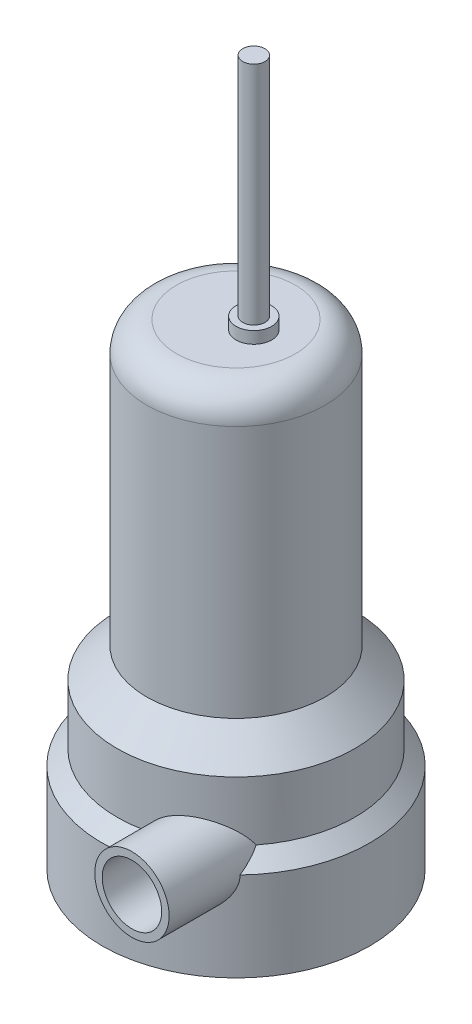
ISO-10303-21;
HEADER;
FILE_DESCRIPTION(('STEP AP214'),'2;1');
FILE_NAME('part.step','',(''),(''),'','','');
FILE_SCHEMA(('AUTOMOTIVE_DESIGN { 1 0 10303 214 1 1 1 1 }'));
ENDSEC;
DATA;
#1=APPLICATION_CONTEXT('core data for automotive mechanical design processes');
#2=APPLICATION_PROTOCOL_DEFINITION('international standard','automotive_design',2000,#1);
#3=PRODUCT_CONTEXT('',#1,'mechanical');
#4=PRODUCT('Part','Part','',(#3));
#5=PRODUCT_RELATED_PRODUCT_CATEGORY('part','',(#4));
#6=PRODUCT_DEFINITION_FORMATION('','',#4);
#7=PRODUCT_DEFINITION_CONTEXT('part definition',#1,'design');
#8=PRODUCT_DEFINITION('design','',#6,#7);
#9=PRODUCT_DEFINITION_SHAPE('','',#8);
#10=(LENGTH_UNIT() NAMED_UNIT(*) SI_UNIT(.MILLI.,.METRE.));
#11=(NAMED_UNIT(*) PLANE_ANGLE_UNIT() SI_UNIT($,.RADIAN.));
#12=(NAMED_UNIT(*) SI_UNIT($,.STERADIAN.) SOLID_ANGLE_UNIT());
#13=UNCERTAINTY_MEASURE_WITH_UNIT(LENGTH_MEASURE(1.E-05),#10,'distance_accuracy_value','');
#14=(GEOMETRIC_REPRESENTATION_CONTEXT(3) GLOBAL_UNCERTAINTY_ASSIGNED_CONTEXT((#13)) GLOBAL_UNIT_ASSIGNED_CONTEXT((#10,
#11,#12)) REPRESENTATION_CONTEXT('',''));
#15=CARTESIAN_POINT('',(0.,0.,0.));
#16=DIRECTION('',(0.,0.,1.));
#17=DIRECTION('',(1.,0.,0.));
#18=AXIS2_PLACEMENT_3D('',#15,#16,#17);
#19=CARTESIAN_POINT('',(7.62000000000001,304.8,0.));
#20=DIRECTION('',(0.,-1.,0.));
#21=DIRECTION('',(1.,0.,0.));
#22=AXIS2_PLACEMENT_3D('',#19,#20,#21);
#23=CYLINDRICAL_SURFACE('',#22,4.7625);
#24=CARTESIAN_POINT('',(7.62000000000001,208.28,0.));
#25=DIRECTION('',(0.,1.,0.));
#26=DIRECTION('',(-1.,0.,0.));
#27=AXIS2_PLACEMENT_3D('',#24,#25,#26);
#28=CIRCLE('',#27,4.7625);
#29=CARTESIAN_POINT('',(2.85750000000001,208.28,0.));
#30=VERTEX_POINT('',#29);
#31=EDGE_CURVE('E47',#30,#30,#28,.T.);
#32=ORIENTED_EDGE('',*,*,#31,.T.);
#33=EDGE_LOOP('',(#32));
#34=FACE_BOUND('',#33,.T.);
#35=CARTESIAN_POINT('',(7.62000000000001,304.8,0.));
#36=DIRECTION('',(0.,1.,0.));
#37=DIRECTION('',(-1.,0.,0.));
#38=AXIS2_PLACEMENT_3D('',#35,#36,#37);
#39=CIRCLE('',#38,4.7625);
#40=CARTESIAN_POINT('',(2.85750000000001,304.8,0.));
#41=VERTEX_POINT('',#40);
#42=EDGE_CURVE('E11',#41,#41,#39,.T.);
#43=ORIENTED_EDGE('',*,*,#42,.F.);
#44=EDGE_LOOP('',(#43));
#45=FACE_BOUND('',#44,.T.);
#46=ADVANCED_FACE('F44',(#34,#45),#23,.T.);
#47=CARTESIAN_POINT('',(7.62000000000001,304.8,0.));
#48=DIRECTION('',(0.,1.,0.));
#49=DIRECTION('',(-1.,0.,0.));
#50=AXIS2_PLACEMENT_3D('',#47,#48,#49);
#51=PLANE('',#50);
#52=ORIENTED_EDGE('',*,*,#42,.T.);
#53=EDGE_LOOP('',(#52));
#54=FACE_BOUND('',#53,.T.);
#55=ADVANCED_FACE('F67',(#54),#51,.T.);
#56=CARTESIAN_POINT('',(7.62000000000001,208.28,0.));
#57=DIRECTION('',(0.,-1.,0.));
#58=DIRECTION('',(1.,0.,0.));
#59=AXIS2_PLACEMENT_3D('',#56,#57,#58);
#60=CYLINDRICAL_SURFACE('',#59,7.62);
#61=CARTESIAN_POINT('',(7.62000000000001,208.28,0.));
#62=DIRECTION('',(0.,1.,0.));
#63=DIRECTION('',(-1.,0.,0.));
#64=AXIS2_PLACEMENT_3D('',#61,#62,#63);
#65=CIRCLE('',#64,7.62);
#66=CARTESIAN_POINT('',(0.,208.28,0.));
#67=VERTEX_POINT('',#66);
#68=EDGE_CURVE('E54',#67,#67,#65,.T.);
#69=ORIENTED_EDGE('',*,*,#68,.F.);
#70=EDGE_LOOP('',(#69));
#71=FACE_BOUND('',#70,.T.);
#72=CARTESIAN_POINT('',(7.62000000000001,203.2,0.));
#73=DIRECTION('',(0.,1.,0.));
#74=DIRECTION('',(-1.,0.,0.));
#75=AXIS2_PLACEMENT_3D('',#72,#73,#74);
#76=CIRCLE('',#75,7.62);
#77=CARTESIAN_POINT('',(0.,203.2,0.));
#78=VERTEX_POINT('',#77);
#79=EDGE_CURVE('E56',#78,#78,#76,.T.);
#80=ORIENTED_EDGE('',*,*,#79,.T.);
#81=EDGE_LOOP('',(#80));
#82=FACE_BOUND('',#81,.T.);
#83=ADVANCED_FACE('F64',(#71,#82),#60,.T.);
#84=CARTESIAN_POINT('',(7.62000000000001,208.28,0.));
#85=DIRECTION('',(0.,1.,0.));
#86=DIRECTION('',(-1.,0.,0.));
#87=AXIS2_PLACEMENT_3D('',#84,#85,#86);
#88=PLANE('',#87);
#89=ORIENTED_EDGE('',*,*,#31,.F.);
#90=EDGE_LOOP('',(#89));
#91=FACE_BOUND('',#90,.T.);
#92=ORIENTED_EDGE('',*,*,#68,.T.);
#93=EDGE_LOOP('',(#92));
#94=FACE_BOUND('',#93,.T.);
#95=ADVANCED_FACE('F62',(#91,#94),#88,.T.);
#96=CARTESIAN_POINT('',(7.62000000000001,203.2,0.));
#97=DIRECTION('',(0.,1.,0.));
#98=DIRECTION('',(-1.,0.,0.));
#99=AXIS2_PLACEMENT_3D('',#96,#97,#98);
#100=PLANE('',#99);
#101=ORIENTED_EDGE('',*,*,#79,.F.);
#102=EDGE_LOOP('',(#101));
#103=FACE_BOUND('',#102,.T.);
#104=ADVANCED_FACE('F71',(#103),#100,.F.);
#105=CLOSED_SHELL('',(#46,#55,#83,#95,#104));
#106=MANIFOLD_SOLID_BREP('B2',#105);
#107=CARTESIAN_POINT('',(0.,203.2,0.));
#108=DIRECTION('',(0.,1.,0.));
#109=DIRECTION('',(-1.,0.,0.));
#110=AXIS2_PLACEMENT_3D('',#107,#108,#109);
#111=CYLINDRICAL_SURFACE('',#110,50.8);
#112=CARTESIAN_POINT('',(0.,69.85,0.));
#113=DIRECTION('',(0.,1.,0.));
#114=DIRECTION('',(-1.,0.,0.));
#115=AXIS2_PLACEMENT_3D('',#112,#113,#114);
#116=CIRCLE('',#115,50.8);
#117=CARTESIAN_POINT('',(-50.8,69.85,0.));
#118=VERTEX_POINT('',#117);
#119=EDGE_CURVE('E221',#118,#118,#116,.T.);
#120=ORIENTED_EDGE('',*,*,#119,.F.);
#121=EDGE_LOOP('',(#120));
#122=FACE_BOUND('',#121,.T.);
#123=CARTESIAN_POINT('',(0.,44.45,0.));
#124=DIRECTION('',(0.,1.,0.));
#125=DIRECTION('',(-1.,0.,0.));
#126=AXIS2_PLACEMENT_3D('',#123,#124,#125);
#127=CIRCLE('',#126,50.8);
#128=CARTESIAN_POINT('',(39.9496778314847,44.45,31.3793441798992));
#129=VERTEX_POINT('',#128);
#130=CARTESIAN_POINT('',(10.8503221685152,44.45,49.6277191581421));
#131=VERTEX_POINT('',#130);
#132=EDGE_CURVE('E145',#129,#131,#127,.T.);
#133=ORIENTED_EDGE('',*,*,#132,.T.);
#134=CARTESIAN_POINT('',(9.52499999999999,38.1,49.8990418244679));
#135=CARTESIAN_POINT('',(9.52499618085346,38.5370308789193,49.8990404846731));
#136=CARTESIAN_POINT('',(9.54305478219028,38.9740027566476,49.8956050304368));
#137=CARTESIAN_POINT('',(9.61514801064026,39.8449988630249,49.881763474594));
#138=CARTESIAN_POINT('',(9.66919157125101,40.2790223326768,49.8713556420457));
#139=CARTESIAN_POINT('',(9.81291914570813,41.1413522810652,49.8432739865549));
#140=CARTESIAN_POINT('',(9.90264062733632,41.5696522588768,49.8255925244097));
#141=CARTESIAN_POINT('',(10.1170000234343,42.4170016010482,49.7825094965424));
#142=CARTESIAN_POINT('',(10.2416357206358,42.8360515510194,49.7571084210549));
#143=CARTESIAN_POINT('',(10.5247889471501,43.6618537102898,49.697984995647));
#144=CARTESIAN_POINT('',(10.683300205208,44.0686081799177,49.6642641857495));
#145=CARTESIAN_POINT('',(11.0329067038487,44.8669907240648,49.5877703399404));
#146=CARTESIAN_POINT('',(11.2240024077956,45.2586185833803,49.5449971752984));
#147=CARTESIAN_POINT('',(11.637085391815,46.0238110975859,49.4496019955457));
#148=CARTESIAN_POINT('',(11.8590627416569,46.3973815071626,49.3969831445222));
#149=CARTESIAN_POINT('',(12.3320179826047,47.1239323857651,49.2810367656791));
#150=CARTESIAN_POINT('',(12.5829956116063,47.4769130408376,49.2177093346412));
#151=CARTESIAN_POINT('',(13.1106252351373,48.1584215058334,49.0797873236814));
#152=CARTESIAN_POINT('',(13.3871679341001,48.4870434924389,49.0052399235878));
#153=CARTESIAN_POINT('',(13.9642864074532,49.1192220974252,48.8439192215374));
#154=CARTESIAN_POINT('',(14.2648620517974,49.4227788514198,48.7571459857345));
#155=CARTESIAN_POINT('',(14.8872666129786,50.002900183955,48.5707194707573));
#156=CARTESIAN_POINT('',(15.2090941220709,50.2794665473647,48.4710670442956));
#157=CARTESIAN_POINT('',(15.8710537906574,50.804060808224,48.2583721442318));
#158=CARTESIAN_POINT('',(16.2111860102921,51.0520886119013,48.1453296266347));
#159=CARTESIAN_POINT('',(16.907766595487,51.5191659068066,47.9051517856742));
#160=CARTESIAN_POINT('',(17.2642640081582,51.7381194388326,47.7779722217223));
#161=CARTESIAN_POINT('',(17.9893449649038,52.1453092873577,47.5097135219094));
#162=CARTESIAN_POINT('',(18.3579284728986,52.333545695544,47.368634427539));
#163=CARTESIAN_POINT('',(19.1040282856596,52.678936017969,47.0726796030206));
#164=CARTESIAN_POINT('',(19.4815452500599,52.8360876288808,46.9178028517236));
#165=CARTESIAN_POINT('',(20.2424135861232,53.1193120851099,46.5945872063999));
#166=CARTESIAN_POINT('',(20.625765136403,53.2453839769296,46.4262478995638));
#167=CARTESIAN_POINT('',(21.4138836654443,53.4721374851956,46.0682294334148));
#168=CARTESIAN_POINT('',(21.8187953035337,53.5713098031045,45.87791380173));
#169=CARTESIAN_POINT('',(22.6287833368121,53.7367155741599,45.4838547506153));
#170=CARTESIAN_POINT('',(23.0338597360698,53.8029481573313,45.2801109766941));
#171=CARTESIAN_POINT('',(23.8415722275717,53.9035633243601,44.8600791620038));
#172=CARTESIAN_POINT('',(24.2442075950832,53.9379368692559,44.6437875796875));
#173=CARTESIAN_POINT('',(25.0445679079879,53.9760773913674,44.1997637305413));
#174=CARTESIAN_POINT('',(25.4422926197476,53.9798429179101,43.9720309219668));
#175=CARTESIAN_POINT('',(26.2783400653202,53.9568423552927,43.4781788127993));
#176=CARTESIAN_POINT('',(26.7157815283144,53.9263435145041,43.2107401608801));
#177=CARTESIAN_POINT('',(27.57964817471,53.8306600061064,42.6645549674426));
#178=CARTESIAN_POINT('',(28.0060725740228,53.7654728768095,42.3858076246894));
#179=CARTESIAN_POINT('',(28.8461868470011,53.6023415465377,41.818590115323));
#180=CARTESIAN_POINT('',(29.2598720571239,53.5043855016524,41.530116467208));
#181=CARTESIAN_POINT('',(30.0728800872641,53.2775477407856,40.9452405976702));
#182=CARTESIAN_POINT('',(30.4722022761185,53.1486646676636,40.6488380288175));
#183=CARTESIAN_POINT('',(31.3245282427344,52.8362283425538,39.9968788264477));
#184=CARTESIAN_POINT('',(31.7745545658084,52.6470394943452,39.6401216068752));
#185=CARTESIAN_POINT('',(32.6516676294434,52.2302785236787,38.9208222117781));
#186=CARTESIAN_POINT('',(33.0787510702834,52.0027008994033,38.5582792137977));
#187=CARTESIAN_POINT('',(33.9092218071544,51.5105199742579,37.8300149821014));
#188=CARTESIAN_POINT('',(34.3125801667086,51.2458727383769,37.4642904672072));
#189=CARTESIAN_POINT('',(35.0938923565459,50.6807998067708,36.7334289849246));
#190=CARTESIAN_POINT('',(35.4718486566249,50.3803775972767,36.3682919637944));
#191=CARTESIAN_POINT('',(36.1841456867374,49.7589312740706,35.6593350366395));
#192=CARTESIAN_POINT('',(36.5196990014426,49.439524566335,35.315315973728));
#193=CARTESIAN_POINT('',(37.1654195508134,48.7680616001106,34.6351186492402));
#194=CARTESIAN_POINT('',(37.4755821986627,48.4159994668244,34.2989418121683));
#195=CARTESIAN_POINT('',(38.0681585123504,47.6789696473436,33.6400252095561));
#196=CARTESIAN_POINT('',(38.3506181438426,47.2940585205289,33.317263715915));
#197=CARTESIAN_POINT('',(38.8857602319111,46.4894678198604,32.6910831495086));
#198=CARTESIAN_POINT('',(39.1384600480572,46.0698087610342,32.3876528483207));
#199=CARTESIAN_POINT('',(39.5170119510074,45.3674495376677,31.9232971394955));
#200=CARTESIAN_POINT('',(39.6534829836359,45.0962839168862,31.7535030080848));
#201=CARTESIAN_POINT('',(39.9131879180216,44.5402761056038,31.4264374922287));
#202=CARTESIAN_POINT('',(40.0364207205507,44.2554327822205,31.2691671479682));
#203=CARTESIAN_POINT('',(40.2681713688539,43.672378002133,30.9701491187287));
#204=CARTESIAN_POINT('',(40.3767068550601,43.3741831532763,30.8283828650392));
#205=CARTESIAN_POINT('',(40.5776638447858,42.7644499393314,30.5633907254796));
#206=CARTESIAN_POINT('',(40.6700911823702,42.4529164563789,30.4401581292968));
#207=CARTESIAN_POINT('',(40.8214020339446,41.8771858936912,30.2368327084331));
#208=CARTESIAN_POINT('',(40.8833248017529,41.6151136928943,30.1529857516837));
#209=CARTESIAN_POINT('',(40.9944431679282,41.0837199001356,30.0017406820251));
#210=CARTESIAN_POINT('',(41.0436450709587,40.8144019726275,29.9343344217859));
#211=CARTESIAN_POINT('',(41.1284086848854,40.2699345447397,29.8177666418474));
#212=CARTESIAN_POINT('',(41.1639813803796,39.994789929994,29.7685904304966));
#213=CARTESIAN_POINT('',(41.220781680388,39.4402127586864,29.6898893301752));
#214=CARTESIAN_POINT('',(41.2420093440893,39.1607802198213,29.6603643601242));
#215=CARTESIAN_POINT('',(41.2696830745679,38.5984072773399,29.6218472579228));
#216=CARTESIAN_POINT('',(41.2760576947545,38.3154564737768,29.6129543717621));
#217=CARTESIAN_POINT('',(41.2736561828815,37.7497522500345,29.6163013958697));
#218=CARTESIAN_POINT('',(41.2648803336368,37.4669988262693,29.628540911658));
#219=CARTESIAN_POINT('',(41.2323871245104,36.9038659359366,29.6737428717344));
#220=CARTESIAN_POINT('',(41.2086609780396,36.623487963744,29.7067175024414));
#221=CARTESIAN_POINT('',(41.1468206766669,36.0673700400181,29.7923130899672));
#222=CARTESIAN_POINT('',(41.108704889684,35.7916306182986,29.8449362753286));
#223=CARTESIAN_POINT('',(41.0114804248668,35.201590259081,29.9784313633694));
#224=CARTESIAN_POINT('',(40.9499483881038,34.8884164988576,30.0625280607495));
#225=CARTESIAN_POINT('',(40.8099624135989,34.2726614811968,30.2522875795851));
#226=CARTESIAN_POINT('',(40.731505386424,33.9700821693718,30.3579543381803));
#227=CARTESIAN_POINT('',(40.4727689863297,33.0790572784094,30.7030478534852));
#228=CARTESIAN_POINT('',(40.2692310927213,32.5079431385415,30.9704174877466));
#229=CARTESIAN_POINT('',(39.8684053668174,31.5517610796026,31.4837856534266));
#230=CARTESIAN_POINT('',(39.6820964640074,31.1556903373193,31.7186275234348));
#231=CARTESIAN_POINT('',(39.2840399305922,30.3905981722854,32.2103119553811));
#232=CARTESIAN_POINT('',(39.0722796887391,30.0215903063326,32.4671654059119));
#233=CARTESIAN_POINT('',(38.625596054024,29.3093023838166,32.997329594686));
#234=CARTESIAN_POINT('',(38.3906316091365,28.9660698865943,33.2706691546678));
#235=CARTESIAN_POINT('',(37.8997328127126,28.305015151045,33.8288114423616));
#236=CARTESIAN_POINT('',(37.6437993652494,27.9871918183746,34.1136136755943));
#237=CARTESIAN_POINT('',(37.0107894472674,27.2594054425023,34.8013674531928));
#238=CARTESIAN_POINT('',(36.6247647509947,26.8605857530611,35.2079171838929));
#239=CARTESIAN_POINT('',(35.8176991199402,26.1086962714292,36.0286564889946));
#240=CARTESIAN_POINT('',(35.3966462939143,25.7556421204941,36.4428486203756));
#241=CARTESIAN_POINT('',(34.5212060840974,25.0953890549111,37.2731870769841));
#242=CARTESIAN_POINT('',(34.0668004718782,24.7882154980964,37.6893343527184));
#243=CARTESIAN_POINT('',(33.1265736746255,24.2213489755409,38.518345514927));
#244=CARTESIAN_POINT('',(32.6407565669736,23.9616498640434,38.9312098197668));
#245=CARTESIAN_POINT('',(31.6364710035289,23.4907094219678,39.7516855836012));
#246=CARTESIAN_POINT('',(31.1178279292346,23.2797609038749,40.1592520966625));
#247=CARTESIAN_POINT('',(30.0527351738776,22.9116749695449,40.9623985872028));
#248=CARTESIAN_POINT('',(29.5062822527471,22.7545438400217,41.357977159386));
#249=CARTESIAN_POINT('',(28.3896692470062,22.4985665837435,42.1322546260228));
#250=CARTESIAN_POINT('',(27.8195574754792,22.3996073848249,42.5109849353567));
#251=CARTESIAN_POINT('',(26.9495508495549,22.298108524656,43.0636740815404));
#252=CARTESIAN_POINT('',(26.6571066798841,22.2720991595405,43.2453179784794));
#253=CARTESIAN_POINT('',(26.0677687940933,22.236303304031,43.6030988535563));
#254=CARTESIAN_POINT('',(25.7708740153918,22.2265207520933,43.7792344845922));
#255=CARTESIAN_POINT('',(25.0405488834466,22.2232036394281,44.202484009948));
#256=CARTESIAN_POINT('',(24.605131209426,22.2388324064959,44.4463184691299));
#257=CARTESIAN_POINT('',(23.7296340413324,22.3070190873671,44.9198410553441));
#258=CARTESIAN_POINT('',(23.2895556464088,22.3595684770346,45.1495324343826));
#259=CARTESIAN_POINT('',(22.408023294206,22.5031087370951,45.5934633230553));
#260=CARTESIAN_POINT('',(21.9665698975364,22.5940855716142,45.8077084411206));
#261=CARTESIAN_POINT('',(21.0858673491369,22.8156924190246,46.2197203348803));
#262=CARTESIAN_POINT('',(20.646618270573,22.9463237393969,46.4174865669617));
#263=CARTESIAN_POINT('',(19.7720642251471,23.2488307635441,46.7967296897001));
#264=CARTESIAN_POINT('',(19.3367953655904,23.420934439172,46.9781086462768));
#265=CARTESIAN_POINT('',(18.4773286685605,23.8061553618007,47.3227504353502));
#266=CARTESIAN_POINT('',(18.0531309498564,24.0192730485865,47.4860130735597));
#267=CARTESIAN_POINT('',(17.2207207576353,24.4859400915235,47.7941810158196));
#268=CARTESIAN_POINT('',(16.812504527176,24.7394798732588,47.939090652431));
#269=CARTESIAN_POINT('',(16.0168174221731,25.285775994068,48.210769567756));
#270=CARTESIAN_POINT('',(15.6293445961926,25.5785286350838,48.3375405547474));
#271=CARTESIAN_POINT('',(14.9160824106061,26.171175257687,48.5620895253456));
#272=CARTESIAN_POINT('',(14.5879508054806,26.4676444015381,48.6614854838893));
#273=CARTESIAN_POINT('',(13.9557168726249,27.0890746617835,48.8465605199252));
#274=CARTESIAN_POINT('',(13.6516130066704,27.4140339514617,48.9322404758588));
#275=CARTESIAN_POINT('',(13.0703666991902,28.0902795727105,49.0906945985694));
#276=CARTESIAN_POINT('',(12.7932263025873,28.4415678975169,49.1634677868347));
#277=CARTESIAN_POINT('',(12.3998837319297,28.9861201368122,49.2635889437675));
#278=CARTESIAN_POINT('',(12.2724922797208,29.1705829337855,49.2954574645029));
#279=CARTESIAN_POINT('',(12.0253975598782,29.5451196239965,49.3563167179262));
#280=CARTESIAN_POINT('',(11.9056962650615,29.7351949389481,49.3853067131956));
#281=CARTESIAN_POINT('',(11.5673244584674,30.2987361407848,49.4660435073289));
#282=CARTESIAN_POINT('',(11.359451821534,30.6793081607814,49.5140546965008));
#283=CARTESIAN_POINT('',(10.9752159726285,31.4570023371567,49.6006395449331));
#284=CARTESIAN_POINT('',(10.7988525741719,31.8541243955684,49.639213260049));
#285=CARTESIAN_POINT('',(10.4792334851454,32.6617368863019,49.7076691954238));
#286=CARTESIAN_POINT('',(10.3359432734317,33.0722128646136,49.7375604867293));
#287=CARTESIAN_POINT('',(10.0834425690929,33.9038626239943,49.7893639199181));
#288=CARTESIAN_POINT('',(9.97422404337037,34.3250338580759,49.8112779428094));
#289=CARTESIAN_POINT('',(9.76383817908721,35.2996622403224,49.853007356643));
#290=CARTESIAN_POINT('',(9.67436297053824,35.8557905552856,49.8703355028428));
#291=CARTESIAN_POINT('',(9.5549459341658,36.9746451159478,49.893353678384));
#292=CARTESIAN_POINT('',(9.5250049167255,37.5373714513545,49.8990435493045));
#293=CARTESIAN_POINT('',(9.52499999999999,38.1,49.8990418244679));
#294=B_SPLINE_CURVE_WITH_KNOTS('',3,(#134,#135,#136,#137,#138,#139,#140,#141,#142,#143,#144,
#145,#146,#147,#148,#149,#150,#151,#152,#153,#154,#155,#156,#157,#158,#159,#160,#161,#162,#163,
#164,#165,#166,#167,#168,#169,#170,#171,#172,#173,#174,#175,#176,#177,#178,#179,#180,#181,#182,
#183,#184,#185,#186,#187,#188,#189,#190,#191,#192,#193,#194,#195,#196,#197,#198,#199,#200,#201,
#202,#203,#204,#205,#206,#207,#208,#209,#210,#211,#212,#213,#214,#215,#216,#217,#218,#219,#220,
#221,#222,#223,#224,#225,#226,#227,#228,#229,#230,#231,#232,#233,#234,#235,#236,#237,#238,#239,
#240,#241,#242,#243,#244,#245,#246,#247,#248,#249,#250,#251,#252,#253,#254,#255,#256,#257,#258,
#259,#260,#261,#262,#263,#264,#265,#266,#267,#268,#269,#270,#271,#272,#273,#274,#275,#276,#277,
#278,#279,#280,#281,#282,#283,#284,#285,#286,#287,#288,#289,#290,#291,#292,#293),.UNSPECIFIED.,
.T.,.F.,(4,2,2,2,2,2,2,2,2,2,2,2,2,2,2,2,2,2,2,2,2,2,2,2,2,2,2,2,2,2,2,2,2,2,2,2,2,2,2,2,2,2,2,
2,2,2,2,2,2,2,2,2,2,2,2,2,2,2,2,2,2,2,2,2,2,2,2,2,2,2,2,2,2,2,2,2,2,2,2,4),(0.,1.31060463148651,
2.62153475037272,3.93384521625949,5.24607236121399,6.55805678861106,7.87005987451875,
9.18164204670048,10.4932123657384,11.7994141508399,13.1056088683643,14.4117171488804,
15.7178297209038,17.0281512810122,18.3384689298865,19.6488836345806,20.9593385366115,
22.3326986181328,23.7060949697058,25.0798808584726,26.4537318577131,27.9930888829021,
29.5325551646074,31.0725784692099,32.6126693655105,34.4248062100247,36.2372029880654,
38.0517662913674,39.8661529119957,41.5958036037422,43.3257660699979,45.0528077679467,
46.7788370006503,47.8217031880249,48.8646559023198,49.9063455037344,50.9476570373869,
51.7930040039962,52.6379311965252,53.4821759716876,54.3264172635043,55.174711242538,
56.0229893865797,56.8717665462711,57.7206400036742,58.7092989855847,59.6981385870461,
61.6777294392342,63.1661612869475,64.6553337234158,66.1471896257505,67.6389812409207,
69.7002674831579,71.7622563626748,73.8253807029389,75.8882377740864,77.9631804609707,
80.0383654510589,82.1095033302804,83.1448568358028,84.1804615981993,85.6767354163475,
87.1726638922142,88.6680464423322,90.1634783033042,91.6673259333,93.1711896896525,
94.674697767161,96.1780641526129,97.5361311296249,98.8941110944141,100.252193968924,
100.931296958207,101.610573473159,102.917764447332,104.224947684757,105.530760276768,
106.836264763641,108.523499190595,110.210756584134),.UNSPECIFIED.);
#295=EDGE_CURVE('E153',#131,#129,#294,.T.);
#296=ORIENTED_EDGE('',*,*,#295,.T.);
#297=EDGE_LOOP('',(#133,#296));
#298=FACE_BOUND('',#297,.T.);
#299=ADVANCED_FACE('F117',(#122,#298),#111,.T.);
#300=CARTESIAN_POINT('',(0.,203.2,0.));
#301=DIRECTION('',(0.,1.,0.));
#302=DIRECTION('',(-1.,0.,0.));
#303=AXIS2_PLACEMENT_3D('',#300,#301,#302);
#304=CYLINDRICAL_SURFACE('',#303,57.15);
#305=CARTESIAN_POINT('',(0.,0.,0.));
#306=DIRECTION('',(0.,1.,0.));
#307=DIRECTION('',(-1.,0.,0.));
#308=AXIS2_PLACEMENT_3D('',#305,#306,#307);
#309=CIRCLE('',#308,57.15);
#310=CARTESIAN_POINT('',(-57.15,0.,0.));
#311=VERTEX_POINT('',#310);
#312=EDGE_CURVE('E155',#311,#311,#309,.T.);
#313=ORIENTED_EDGE('',*,*,#312,.T.);
#314=EDGE_LOOP('',(#313));
#315=FACE_BOUND('',#314,.T.);
#316=CARTESIAN_POINT('',(0.,38.1,0.));
#317=DIRECTION('',(0.,1.,0.));
#318=DIRECTION('',(-1.,0.,0.));
#319=AXIS2_PLACEMENT_3D('',#316,#317,#318);
#320=CIRCLE('',#319,57.15);
#321=CARTESIAN_POINT('',(41.275,38.1,39.5284312236142));
#322=VERTEX_POINT('',#321);
#323=CARTESIAN_POINT('',(9.52499999999999,38.1,56.3506599340238));
#324=VERTEX_POINT('',#323);
#325=EDGE_CURVE('E226',#322,#324,#320,.T.);
#326=ORIENTED_EDGE('',*,*,#325,.F.);
#327=CARTESIAN_POINT('',(41.275,38.1,39.5284312236142));
#328=CARTESIAN_POINT('',(41.27500315309,37.9182405761465,39.5284254452232));
#329=CARTESIAN_POINT('',(41.2718774577418,37.7365120074799,39.531692024049));
#330=CARTESIAN_POINT('',(41.2594077432969,37.3735157487592,39.5447075088331));
#331=CARTESIAN_POINT('',(41.2500642460319,37.1922480213102,39.5544558708048));
#332=CARTESIAN_POINT('',(41.2128017282125,36.6502187144738,39.5932929385827));
#333=CARTESIAN_POINT('',(41.1756504352807,36.2906963996427,39.6319740006776));
#334=CARTESIAN_POINT('',(41.0781322381908,35.582403015225,39.7330386809974));
#335=CARTESIAN_POINT('',(41.0180243376626,35.2335572867025,39.7951577727984));
#336=CARTESIAN_POINT('',(40.8758226479241,34.5449802904855,39.9412067411005));
#337=CARTESIAN_POINT('',(40.7937234374659,34.2052512929771,40.0251419955212));
#338=CARTESIAN_POINT('',(40.609469615276,33.5385629490685,40.2120698314504));
#339=CARTESIAN_POINT('',(40.5074121823407,33.2115505829848,40.3149699365676));
#340=CARTESIAN_POINT('',(40.2845717808327,32.5700331292627,40.5376449086336));
#341=CARTESIAN_POINT('',(40.1637898256528,32.2555273659093,40.6574188623183));
#342=CARTESIAN_POINT('',(39.7746960430264,31.3300499898669,41.039344341256));
#343=CARTESIAN_POINT('',(39.4801420737558,30.7389037205947,41.3235769838365));
#344=CARTESIAN_POINT('',(38.9156043760008,29.7587153150404,41.8546034164677));
#345=CARTESIAN_POINT('',(38.6587629677571,29.3567785423553,42.0922441017551));
#346=CARTESIAN_POINT('',(38.1156430614138,28.5841762661623,42.5846747060221));
#347=CARTESIAN_POINT('',(37.8293525357106,28.2135236531398,42.8394716171519));
#348=CARTESIAN_POINT('',(37.2299105314856,27.5035406269406,43.3614392134773));
#349=CARTESIAN_POINT('',(36.9167384010101,27.1642347191438,43.6286193383342));
#350=CARTESIAN_POINT('',(36.2658657540408,26.5172943902227,44.1711326493548));
#351=CARTESIAN_POINT('',(35.9281678648188,26.2096565852275,44.4464649603662));
#352=CARTESIAN_POINT('',(35.2224260629773,25.6199531146422,45.0078981347963));
#353=CARTESIAN_POINT('',(34.8538843109636,25.3385831454706,45.2941031454967));
#354=CARTESIAN_POINT('',(34.0946327714631,24.809663982391,45.8683452207947));
#355=CARTESIAN_POINT('',(33.7039226662407,24.5621152734117,46.1563823115985));
#356=CARTESIAN_POINT('',(32.9018870445924,24.1017470274322,46.7314861792126));
#357=CARTESIAN_POINT('',(32.4905623207773,23.8889261565196,47.0185529928768));
#358=CARTESIAN_POINT('',(31.6488527284274,23.4992272149324,47.5891921295719));
#359=CARTESIAN_POINT('',(31.2184664868006,23.3223517387216,47.8727641989729));
#360=CARTESIAN_POINT('',(30.2829563707031,22.9854124714904,48.4707336718226));
#361=CARTESIAN_POINT('',(29.7754161894872,22.8305671628025,48.7843160206444));
#362=CARTESIAN_POINT('',(28.7411348146231,22.5714241255555,49.4007299822234));
#363=CARTESIAN_POINT('',(28.2143915830624,22.4671317787885,49.7035604471724));
#364=CARTESIAN_POINT('',(27.1454722997587,22.3120130229825,50.2953169010462));
#365=CARTESIAN_POINT('',(26.6032986002625,22.2611785091038,50.5842449913951));
#366=CARTESIAN_POINT('',(25.508007216561,22.2159121492216,51.145307283875));
#367=CARTESIAN_POINT('',(24.954891275339,22.221471391349,51.4174441326766));
#368=CARTESIAN_POINT('',(23.8931680618057,22.2885470839721,51.9187069535981));
#369=CARTESIAN_POINT('',(23.3850275024927,22.3449903811587,52.1495004324489));
#370=CARTESIAN_POINT('',(22.369063870494,22.5085376301809,52.5932946545688));
#371=CARTESIAN_POINT('',(21.86124078693,22.6156397387639,52.8062960448825));
#372=CARTESIAN_POINT('',(20.8519597603416,22.8814910975041,53.2129121167602));
#373=CARTESIAN_POINT('',(20.350495978024,23.0401887680981,53.4065459081648));
#374=CARTESIAN_POINT('',(19.3595162517042,23.4096066728741,53.7736991408177));
#375=CARTESIAN_POINT('',(18.8699983741499,23.6203184259109,53.9472218545018));
#376=CARTESIAN_POINT('',(17.976934283001,24.0598630073342,54.2507382537316));
#377=CARTESIAN_POINT('',(17.5709815659138,24.2819763817171,54.3834214378615));
#378=CARTESIAN_POINT('',(16.7767332532978,24.7631932497343,54.6336620248193));
#379=CARTESIAN_POINT('',(16.3884358361321,25.0222929157292,54.7512209904327));
#380=CARTESIAN_POINT('',(15.6336861032471,25.5758752053689,54.9714918199449));
#381=CARTESIAN_POINT('',(15.2672256790407,25.8703445715409,55.0742092152399));
#382=CARTESIAN_POINT('',(14.5598709996675,26.4927129592846,55.2654223943301));
#383=CARTESIAN_POINT('',(14.2189757464418,26.8206106746402,55.3539187334666));
#384=CARTESIAN_POINT('',(13.5913466911125,27.4810210931051,55.5112093193986));
#385=CARTESIAN_POINT('',(13.3024645067593,27.811260837402,55.5809929829456));
#386=CARTESIAN_POINT('',(12.7521526615302,28.49581256758,55.7098284005506));
#387=CARTESIAN_POINT('',(12.4907215176836,28.8501232513868,55.7688807344666));
#388=CARTESIAN_POINT('',(11.9975347456766,29.5803904994807,55.8770565195311));
#389=CARTESIAN_POINT('',(11.7657868069118,29.9563526361319,55.9261773998482));
#390=CARTESIAN_POINT('',(11.3340394716074,30.727111803359,56.015271697046));
#391=CARTESIAN_POINT('',(11.134039303468,31.1219083758781,56.0552453362522));
#392=CARTESIAN_POINT('',(10.7700186396443,31.9218357204989,56.1263139861816));
#393=CARTESIAN_POINT('',(10.60553666445,32.3267465657118,56.1575246875794));
#394=CARTESIAN_POINT('',(10.3103810056394,33.1492558913841,56.2124641353584));
#395=CARTESIAN_POINT('',(10.179707040596,33.5668542661966,56.2361929440212));
#396=CARTESIAN_POINT('',(10.0099229178682,34.2001417806297,56.2665726130606));
#397=CARTESIAN_POINT('',(9.95771898864253,34.4122777025773,56.2758269050151));
#398=CARTESIAN_POINT('',(9.86210585932849,34.8385318734003,56.2926613277028));
#399=CARTESIAN_POINT('',(9.81869461175293,35.0526496486042,56.300241848232));
#400=CARTESIAN_POINT('',(9.70180166088144,35.6973367400156,56.3205463088541));
#401=CARTESIAN_POINT('',(9.64159261910188,36.130493991668,56.3308451741693));
#402=CARTESIAN_POINT('',(9.57456631769412,36.820513512907,56.3422644117939));
#403=CARTESIAN_POINT('',(9.55596756977294,37.0762786277688,56.3454189223638));
#404=CARTESIAN_POINT('',(9.53119419417166,37.5880159200422,56.3496131602059));
#405=CARTESIAN_POINT('',(9.52499968596771,37.8439871072818,56.3506562714892));
#406=CARTESIAN_POINT('',(9.52499999999999,38.1,56.3506599340238));
#407=B_SPLINE_CURVE_WITH_KNOTS('',3,(#327,#328,#329,#330,#331,#332,#333,#334,#335,#336,#337,
#338,#339,#340,#341,#342,#343,#344,#345,#346,#347,#348,#349,#350,#351,#352,#353,#354,#355,#356,
#357,#358,#359,#360,#361,#362,#363,#364,#365,#366,#367,#368,#369,#370,#371,#372,#373,#374,#375,
#376,#377,#378,#379,#380,#381,#382,#383,#384,#385,#386,#387,#388,#389,#390,#391,#392,#393,#394,
#395,#396,#397,#398,#399,#400,#401,#402,#403,#404,#405,#406),.UNSPECIFIED.,.F.,.F.,(4,2,2,2,2,2,
2,2,2,2,2,2,2,2,2,2,2,2,2,2,2,2,2,2,2,2,2,2,2,2,2,2,2,2,2,2,2,2,2,4),(0.,0.545161599329806,
1.09027745150536,2.17891240008592,3.25561147637075,4.33257622274317,5.40442211587856,
6.47621001971541,8.62551130353762,10.2224103502933,11.8199642115357,13.4187565802936,
15.0173779335933,16.6505215568033,18.2836885935337,19.9167928847829,21.5500150082757,
23.3966920493541,25.2435656417352,27.0901591858555,28.9364609185313,30.616855640849,
32.2971892256513,33.9758481366447,35.6542335148557,37.0965033385593,38.5386240126259,
39.9802058197912,41.4217313185811,42.7529545207731,44.0841057700774,45.4156011579436,
46.7470641801046,48.0600196870096,49.3729642641652,50.0287783028054,50.6844394508248,
51.9949739071224,52.764085952547,53.5319643368916),.UNSPECIFIED.);
#408=EDGE_CURVE('E156',#322,#324,#407,.T.);
#409=ORIENTED_EDGE('',*,*,#408,.T.);
#410=EDGE_LOOP('',(#326,#409));
#411=FACE_BOUND('',#410,.T.);
#412=ADVANCED_FACE('F194',(#315,#411),#304,.T.);
#413=CARTESIAN_POINT('',(0.,44.45,0.));
#414=DIRECTION('',(0.,-1.,0.));
#415=DIRECTION('',(1.,0.,0.));
#416=AXIS2_PLACEMENT_3D('',#413,#414,#415);
#417=CONICAL_SURFACE('',#416,50.8,0.785398163397445);
#418=CARTESIAN_POINT('',(11.1443833539198,45.0852000000001,48.9112449105609));
#419=CARTESIAN_POINT('',(10.9991636472731,44.7888334578482,49.2482772924383));
#420=CARTESIAN_POINT('',(10.8634396775951,44.4884520837265,49.5858621712599));
#421=CARTESIAN_POINT('',(10.6112143431552,43.8806310045863,50.2618389734442));
#422=CARTESIAN_POINT('',(10.4947123923983,43.5731915150643,50.6002308718853));
#423=CARTESIAN_POINT('',(10.2819407630155,42.9544969964869,51.2750470098329));
#424=CARTESIAN_POINT('',(10.1855282217278,42.6432868226685,51.6114673577196));
#425=CARTESIAN_POINT('',(10.0120586340851,42.0157207877973,52.2845053996696));
#426=CARTESIAN_POINT('',(9.93500179004466,41.6993648729958,52.6211230957589));
#427=CARTESIAN_POINT('',(9.80044247016074,41.062332825727,53.2941922397182));
#428=CARTESIAN_POINT('',(9.74294037426806,40.7416566094416,53.6306436842312));
#429=CARTESIAN_POINT('',(9.64770700513504,40.0967771732042,54.3029558084837));
#430=CARTESIAN_POINT('',(9.60997545275134,39.7725740031158,54.6388164964975));
#431=CARTESIAN_POINT('',(9.5543148289025,39.1189640172285,55.3119850715472));
#432=CARTESIAN_POINT('',(9.53653489133328,38.7895364374957,55.6492851842947));
#433=CARTESIAN_POINT('',(9.52158698319296,38.1285673632179,56.3222966336653));
#434=CARTESIAN_POINT('',(9.52442001967522,37.7970257661824,56.6580078918627));
#435=CARTESIAN_POINT('',(9.53771309173862,37.4648,56.9926431043488));
#436=B_SPLINE_CURVE_WITH_KNOTS('',3,(#418,#419,#420,#421,#422,#423,#424,#425,#426,#427,#428,
#429,#430,#431,#432,#433,#434,#435),.UNSPECIFIED.,.F.,.F.,(4,2,2,2,2,2,2,2,4),(0.,
1.41501628770588,2.82998942979969,4.23452819441637,5.63908163930064,7.04366237324607,
8.44822327516384,9.8632144427672,11.278274740676),.UNSPECIFIED.);
#437=EDGE_CURVE('E42',#131,#324,#436,.T.);
#438=ORIENTED_EDGE('',*,*,#437,.F.);
#439=ORIENTED_EDGE('',*,*,#132,.F.);
#440=CARTESIAN_POINT('',(41.2622869082614,37.4648,40.4543325014802));
#441=CARTESIAN_POINT('',(41.2722311498451,37.7137296734206,40.0886267947406));
#442=CARTESIAN_POINT('',(41.2764172389423,37.9642578382664,39.7238266104213));
#443=CARTESIAN_POINT('',(41.2727273565488,38.4688035934854,38.9965976833494));
#444=CARTESIAN_POINT('',(41.2648488139653,38.7228219162121,38.6341694626172));
#445=CARTESIAN_POINT('',(41.2364111863499,39.2357614504892,37.91067071667));
#446=CARTESIAN_POINT('',(41.2157914743581,39.4947003319553,37.5496150364436));
#447=CARTESIAN_POINT('',(41.1610645040357,40.0165934535678,36.8314746726888));
#448=CARTESIAN_POINT('',(41.126958236916,40.279547397257,36.4743896993111));
#449=CARTESIAN_POINT('',(41.045153971911,40.8044167682633,35.7724987963392));
#450=CARTESIAN_POINT('',(40.997750468665,41.0662419812088,35.4275914561584));
#451=CARTESIAN_POINT('',(40.8879453113642,41.5945643059991,34.74380248233));
#452=CARTESIAN_POINT('',(40.825544764651,41.8610610715626,34.4049204057763));
#453=CARTESIAN_POINT('',(40.684420668094,42.3987480662632,33.7354031167646));
#454=CARTESIAN_POINT('',(40.6057280705893,42.6699285144583,33.4047535791912));
#455=CARTESIAN_POINT('',(40.4301249410613,43.2179862594002,32.7532308378514));
#456=CARTESIAN_POINT('',(40.3332205239104,43.4948616162937,32.4323543945341));
#457=CARTESIAN_POINT('',(40.1850616047687,43.8819274087979,31.9975688505299));
#458=CARTESIAN_POINT('',(40.142581559787,43.989440654125,31.8782429076471));
#459=CARTESIAN_POINT('',(40.054452294893,44.2054291061967,31.6416392893136));
#460=CARTESIAN_POINT('',(40.008803030134,44.3139043265348,31.5243616428772));
#461=CARTESIAN_POINT('',(39.9139942930941,44.5322483020094,31.2916486848488));
#462=CARTESIAN_POINT('',(39.8648222970442,44.642120757914,31.1762219333205));
#463=CARTESIAN_POINT('',(39.7629282285792,44.8628895630652,30.9479222179691));
#464=CARTESIAN_POINT('',(39.7102058243401,44.9737860071766,30.8350494941682));
#465=CARTESIAN_POINT('',(39.6556166460802,45.0852000000001,30.7235939866925));
#466=B_SPLINE_CURVE_WITH_KNOTS('',3,(#440,#441,#442,#443,#444,#445,#446,#447,#448,#449,#450,
#451,#452,#453,#454,#455,#456,#457,#458,#459,#460,#461,#462,#463,#464,#465),.UNSPECIFIED.,.F.,
.F.,(4,2,2,2,2,2,2,2,2,2,2,2,4),(0.,1.32748791167208,2.65525876357054,3.98939679311934,
5.32343678676919,6.62999274114531,7.93645225254769,9.24045210536612,10.5440149017607,
11.042398456469,11.5407890650919,12.0410490213772,12.5413557974264),.UNSPECIFIED.);
#467=EDGE_CURVE('E130',#322,#129,#466,.T.);
#468=ORIENTED_EDGE('',*,*,#467,.F.);
#469=ORIENTED_EDGE('',*,*,#325,.T.);
#470=EDGE_LOOP('',(#438,#439,#468,#469));
#471=FACE_BOUND('',#470,.T.);
#472=ADVANCED_FACE('F147',(#471),#417,.T.);
#473=CARTESIAN_POINT('',(-25.4,203.2,0.));
#474=DIRECTION('',(0.,1.,0.));
#475=DIRECTION('',(-1.,0.,0.));
#476=AXIS2_PLACEMENT_3D('',#473,#474,#475);
#477=PLANE('',#476);
#478=CARTESIAN_POINT('',(0.,203.2,0.));
#479=DIRECTION('',(0.,1.,0.));
#480=DIRECTION('',(-1.,0.,0.));
#481=AXIS2_PLACEMENT_3D('',#478,#479,#480);
#482=CIRCLE('',#481,25.4);
#483=CARTESIAN_POINT('',(-25.4,203.2,0.));
#484=VERTEX_POINT('',#483);
#485=EDGE_CURVE('E151',#484,#484,#482,.T.);
#486=ORIENTED_EDGE('',*,*,#485,.T.);
#487=EDGE_LOOP('',(#486));
#488=FACE_BOUND('',#487,.T.);
#489=ADVANCED_FACE('F208',(#488),#477,.T.);
#490=CARTESIAN_POINT('',(0.,190.5,0.));
#491=DIRECTION('',(0.,1.,0.));
#492=DIRECTION('',(-1.,0.,0.));
#493=AXIS2_PLACEMENT_3D('',#490,#491,#492);
#494=TOROIDAL_SURFACE('',#493,25.4,12.7);
#495=CARTESIAN_POINT('',(0.,190.5,0.));
#496=DIRECTION('',(0.,1.,0.));
#497=DIRECTION('',(-1.,0.,0.));
#498=AXIS2_PLACEMENT_3D('',#495,#496,#497);
#499=CIRCLE('',#498,38.1);
#500=CARTESIAN_POINT('',(-38.1,190.5,0.));
#501=VERTEX_POINT('',#500);
#502=EDGE_CURVE('E218',#501,#501,#499,.T.);
#503=ORIENTED_EDGE('',*,*,#502,.T.);
#504=EDGE_LOOP('',(#503));
#505=FACE_BOUND('',#504,.T.);
#506=ORIENTED_EDGE('',*,*,#485,.F.);
#507=EDGE_LOOP('',(#506));
#508=FACE_BOUND('',#507,.T.);
#509=ADVANCED_FACE('F205',(#505,#508),#494,.T.);
#510=CARTESIAN_POINT('',(0.,203.2,0.));
#511=DIRECTION('',(0.,1.,0.));
#512=DIRECTION('',(-1.,0.,0.));
#513=AXIS2_PLACEMENT_3D('',#510,#511,#512);
#514=CYLINDRICAL_SURFACE('',#513,38.1);
#515=CARTESIAN_POINT('',(0.,82.5500000000001,0.));
#516=DIRECTION('',(0.,1.,0.));
#517=DIRECTION('',(-1.,0.,0.));
#518=AXIS2_PLACEMENT_3D('',#515,#516,#517);
#519=CIRCLE('',#518,38.1);
#520=CARTESIAN_POINT('',(-38.1,82.5500000000001,0.));
#521=VERTEX_POINT('',#520);
#522=EDGE_CURVE('E150',#521,#521,#519,.T.);
#523=ORIENTED_EDGE('',*,*,#522,.T.);
#524=EDGE_LOOP('',(#523));
#525=FACE_BOUND('',#524,.T.);
#526=ORIENTED_EDGE('',*,*,#502,.F.);
#527=EDGE_LOOP('',(#526));
#528=FACE_BOUND('',#527,.T.);
#529=ADVANCED_FACE('F202',(#525,#528),#514,.T.);
#530=CARTESIAN_POINT('',(0.,0.,0.));
#531=DIRECTION('',(0.,-1.,0.));
#532=DIRECTION('',(1.,0.,0.));
#533=AXIS2_PLACEMENT_3D('',#530,#531,#532);
#534=PLANE('',#533);
#535=ORIENTED_EDGE('',*,*,#312,.F.);
#536=EDGE_LOOP('',(#535));
#537=FACE_BOUND('',#536,.T.);
#538=ADVANCED_FACE('F176',(#537),#534,.T.);
#539=CARTESIAN_POINT('',(0.,82.5500000000001,0.));
#540=DIRECTION('',(0.,-1.,0.));
#541=DIRECTION('',(1.,0.,0.));
#542=AXIS2_PLACEMENT_3D('',#539,#540,#541);
#543=CONICAL_SURFACE('',#542,38.1,0.785398163397443);
#544=ORIENTED_EDGE('',*,*,#119,.T.);
#545=EDGE_LOOP('',(#544));
#546=FACE_BOUND('',#545,.T.);
#547=ORIENTED_EDGE('',*,*,#522,.F.);
#548=EDGE_LOOP('',(#547));
#549=FACE_BOUND('',#548,.T.);
#550=ADVANCED_FACE('F119',(#546,#549),#543,.T.);
#551=CARTESIAN_POINT('',(25.4,38.1,69.85));
#552=DIRECTION('',(0.,0.,-1.));
#553=DIRECTION('',(-1.,0.,0.));
#554=AXIS2_PLACEMENT_3D('',#551,#552,#553);
#555=CYLINDRICAL_SURFACE('',#554,15.875);
#556=CARTESIAN_POINT('',(25.4,38.1,69.85));
#557=DIRECTION('',(0.,0.,1.));
#558=DIRECTION('',(1.,0.,0.));
#559=AXIS2_PLACEMENT_3D('',#556,#557,#558);
#560=CIRCLE('',#559,15.875);
#561=CARTESIAN_POINT('',(41.275,38.1,69.85));
#562=VERTEX_POINT('',#561);
#563=EDGE_CURVE('E187',#562,#562,#560,.T.);
#564=ORIENTED_EDGE('',*,*,#563,.F.);
#565=EDGE_LOOP('',(#564));
#566=FACE_BOUND('',#565,.T.);
#567=ORIENTED_EDGE('',*,*,#295,.F.);
#568=ORIENTED_EDGE('',*,*,#437,.T.);
#569=ORIENTED_EDGE('',*,*,#408,.F.);
#570=ORIENTED_EDGE('',*,*,#467,.T.);
#571=EDGE_LOOP('',(#567,#568,#569,#570));
#572=FACE_BOUND('',#571,.T.);
#573=ADVANCED_FACE('F159',(#566,#572),#555,.T.);
#574=CARTESIAN_POINT('',(25.4,38.1,69.85));
#575=DIRECTION('',(0.,0.,-1.));
#576=DIRECTION('',(-1.,0.,0.));
#577=AXIS2_PLACEMENT_3D('',#574,#575,#576);
#578=CYLINDRICAL_SURFACE('',#577,12.7);
#579=CARTESIAN_POINT('',(25.4,38.1,69.85));
#580=DIRECTION('',(0.,0.,1.));
#581=DIRECTION('',(1.,0.,0.));
#582=AXIS2_PLACEMENT_3D('',#579,#580,#581);
#583=CIRCLE('',#582,12.7);
#584=CARTESIAN_POINT('',(38.1,38.1,69.85));
#585=VERTEX_POINT('',#584);
#586=EDGE_CURVE('E339',#585,#585,#583,.T.);
#587=ORIENTED_EDGE('',*,*,#586,.T.);
#588=EDGE_LOOP('',(#587));
#589=FACE_BOUND('',#588,.T.);
#590=CARTESIAN_POINT('',(25.4,38.1,0.));
#591=DIRECTION('',(0.,0.,1.));
#592=DIRECTION('',(1.,0.,0.));
#593=AXIS2_PLACEMENT_3D('',#590,#591,#592);
#594=CIRCLE('',#593,12.7);
#595=CARTESIAN_POINT('',(38.1,38.1,0.));
#596=VERTEX_POINT('',#595);
#597=EDGE_CURVE('E337',#596,#596,#594,.T.);
#598=ORIENTED_EDGE('',*,*,#597,.F.);
#599=EDGE_LOOP('',(#598));
#600=FACE_BOUND('',#599,.T.);
#601=ADVANCED_FACE('F172',(#589,#600),#578,.F.);
#602=CARTESIAN_POINT('',(25.4,38.1,69.85));
#603=DIRECTION('',(0.,0.,1.));
#604=DIRECTION('',(1.,0.,0.));
#605=AXIS2_PLACEMENT_3D('',#602,#603,#604);
#606=PLANE('',#605);
#607=ORIENTED_EDGE('',*,*,#563,.T.);
#608=EDGE_LOOP('',(#607));
#609=FACE_BOUND('',#608,.T.);
#610=ORIENTED_EDGE('',*,*,#586,.F.);
#611=EDGE_LOOP('',(#610));
#612=FACE_BOUND('',#611,.T.);
#613=ADVANCED_FACE('F174',(#609,#612),#606,.T.);
#614=CARTESIAN_POINT('',(25.4,38.1,0.));
#615=DIRECTION('',(0.,0.,1.));
#616=DIRECTION('',(1.,0.,0.));
#617=AXIS2_PLACEMENT_3D('',#614,#615,#616);
#618=PLANE('',#617);
#619=ORIENTED_EDGE('',*,*,#597,.T.);
#620=EDGE_LOOP('',(#619));
#621=FACE_BOUND('',#620,.T.);
#622=ADVANCED_FACE('F263',(#621),#618,.T.);
#623=CLOSED_SHELL('',(#299,#412,#472,#489,#509,#529,#538,#550,#573,#601,#613,#622));
#624=MANIFOLD_SOLID_BREP('B6',#623);
#625=ADVANCED_BREP_SHAPE_REPRESENTATION('',(#18,#106,#624),#14);
#626=SHAPE_DEFINITION_REPRESENTATION(#9,#625);
ENDSEC;
END-ISO-10303-21;
